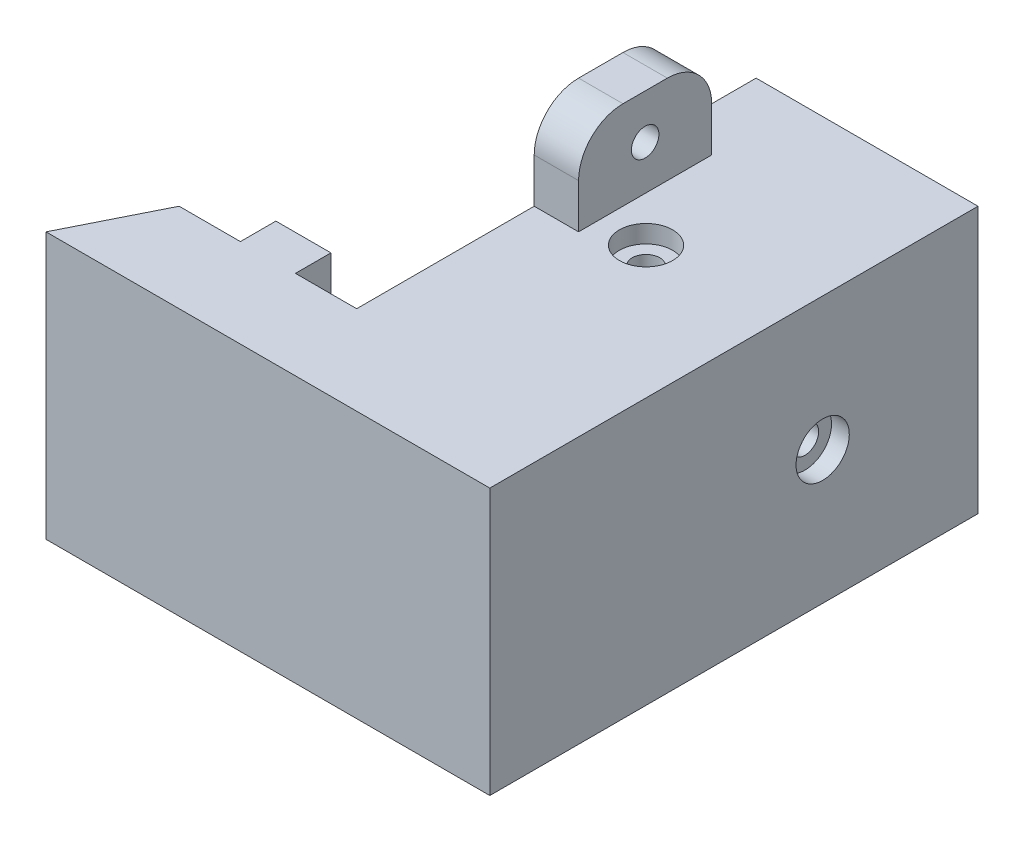
ISO-10303-21;
HEADER;
FILE_DESCRIPTION(('STEP AP214'),'2;1');
FILE_NAME('part.step','',(''),(''),'','','');
FILE_SCHEMA(('AUTOMOTIVE_DESIGN { 1 0 10303 214 1 1 1 1 }'));
ENDSEC;
DATA;
#1=APPLICATION_CONTEXT('core data for automotive mechanical design processes');
#2=APPLICATION_PROTOCOL_DEFINITION('international standard','automotive_design',2000,#1);
#3=PRODUCT_CONTEXT('',#1,'mechanical');
#4=PRODUCT('Part','Part','',(#3));
#5=PRODUCT_RELATED_PRODUCT_CATEGORY('part','',(#4));
#6=PRODUCT_DEFINITION_FORMATION('','',#4);
#7=PRODUCT_DEFINITION_CONTEXT('part definition',#1,'design');
#8=PRODUCT_DEFINITION('design','',#6,#7);
#9=PRODUCT_DEFINITION_SHAPE('','',#8);
#10=(LENGTH_UNIT() NAMED_UNIT(*) SI_UNIT(.MILLI.,.METRE.));
#11=(NAMED_UNIT(*) PLANE_ANGLE_UNIT() SI_UNIT($,.RADIAN.));
#12=(NAMED_UNIT(*) SI_UNIT($,.STERADIAN.) SOLID_ANGLE_UNIT());
#13=UNCERTAINTY_MEASURE_WITH_UNIT(LENGTH_MEASURE(1.E-05),#10,'distance_accuracy_value','');
#14=(GEOMETRIC_REPRESENTATION_CONTEXT(3) GLOBAL_UNCERTAINTY_ASSIGNED_CONTEXT((#13)) GLOBAL_UNIT_ASSIGNED_CONTEXT((#10,
#11,#12)) REPRESENTATION_CONTEXT('',''));
#15=CARTESIAN_POINT('',(0.,0.,0.));
#16=DIRECTION('',(0.,0.,1.));
#17=DIRECTION('',(1.,0.,0.));
#18=AXIS2_PLACEMENT_3D('',#15,#16,#17);
#19=CARTESIAN_POINT('',(30.,0.,-23.5));
#20=DIRECTION('',(1.,0.,0.));
#21=DIRECTION('',(0.,1.,0.));
#22=AXIS2_PLACEMENT_3D('',#19,#20,#21);
#23=CYLINDRICAL_SURFACE('',#22,1.55);
#24=CARTESIAN_POINT('',(30.2,0.,-23.5));
#25=DIRECTION('',(1.,0.,0.));
#26=DIRECTION('',(0.,0.,-1.));
#27=AXIS2_PLACEMENT_3D('',#24,#25,#26);
#28=CIRCLE('',#27,1.55);
#29=CARTESIAN_POINT('',(30.2,0.,-25.05));
#30=VERTEX_POINT('',#29);
#31=EDGE_CURVE('E417',#30,#30,#28,.T.);
#32=ORIENTED_EDGE('',*,*,#31,.F.);
#33=EDGE_LOOP('',(#32));
#34=FACE_BOUND('',#33,.T.);
#35=CARTESIAN_POINT('',(33.,0.,-23.5));
#36=DIRECTION('',(1.,0.,0.));
#37=DIRECTION('',(0.,1.,0.));
#38=AXIS2_PLACEMENT_3D('',#35,#36,#37);
#39=CIRCLE('',#38,1.55);
#40=CARTESIAN_POINT('',(33.,1.55,-23.5));
#41=VERTEX_POINT('',#40);
#42=EDGE_CURVE('E110',#41,#41,#39,.F.);
#43=ORIENTED_EDGE('',*,*,#42,.F.);
#44=EDGE_LOOP('',(#43));
#45=FACE_BOUND('',#44,.T.);
#46=ADVANCED_FACE('F106',(#34,#45),#23,.F.);
#47=CARTESIAN_POINT('',(20.1,110.,-18.5));
#48=DIRECTION('',(0.,-1.,0.));
#49=DIRECTION('',(0.,0.,-1.));
#50=AXIS2_PLACEMENT_3D('',#47,#48,#49);
#51=CYLINDRICAL_SURFACE('',#50,1.55);
#52=CARTESIAN_POINT('',(20.1,9.99999999999999,-18.5));
#53=DIRECTION('',(0.,-1.,0.));
#54=DIRECTION('',(0.,0.,-1.));
#55=AXIS2_PLACEMENT_3D('',#52,#53,#54);
#56=CIRCLE('',#55,1.55);
#57=CARTESIAN_POINT('',(20.1,9.99999999999999,-20.05));
#58=VERTEX_POINT('',#57);
#59=EDGE_CURVE('E296',#58,#58,#56,.T.);
#60=ORIENTED_EDGE('',*,*,#59,.T.);
#61=EDGE_LOOP('',(#60));
#62=FACE_BOUND('',#61,.T.);
#63=CARTESIAN_POINT('',(20.1,13.,-18.5));
#64=DIRECTION('',(0.,1.,0.));
#65=DIRECTION('',(0.,0.,1.));
#66=AXIS2_PLACEMENT_3D('',#63,#64,#65);
#67=CIRCLE('',#66,1.55);
#68=CARTESIAN_POINT('',(20.1,13.,-16.95));
#69=VERTEX_POINT('',#68);
#70=EDGE_CURVE('E412',#69,#69,#67,.F.);
#71=ORIENTED_EDGE('',*,*,#70,.F.);
#72=EDGE_LOOP('',(#71));
#73=FACE_BOUND('',#72,.T.);
#74=ADVANCED_FACE('F696',(#62,#73),#51,.F.);
#75=CARTESIAN_POINT('',(20.1,-85.,-18.5));
#76=DIRECTION('',(0.,1.,0.));
#77=DIRECTION('',(0.,0.,1.));
#78=AXIS2_PLACEMENT_3D('',#75,#76,#77);
#79=CYLINDRICAL_SURFACE('',#78,1.55);
#80=CARTESIAN_POINT('',(20.1,-9.99999999999999,-18.5));
#81=DIRECTION('',(0.,1.,0.));
#82=DIRECTION('',(0.,0.,1.));
#83=AXIS2_PLACEMENT_3D('',#80,#81,#82);
#84=CIRCLE('',#83,1.55);
#85=CARTESIAN_POINT('',(20.1,-9.99999999999999,-16.95));
#86=VERTEX_POINT('',#85);
#87=EDGE_CURVE('E410',#86,#86,#84,.F.);
#88=ORIENTED_EDGE('',*,*,#87,.F.);
#89=EDGE_LOOP('',(#88));
#90=FACE_BOUND('',#89,.T.);
#91=CARTESIAN_POINT('',(20.1,-13.,-18.5));
#92=DIRECTION('',(0.,-1.,0.));
#93=DIRECTION('',(0.,0.,-1.));
#94=AXIS2_PLACEMENT_3D('',#91,#92,#93);
#95=CIRCLE('',#94,1.55);
#96=CARTESIAN_POINT('',(20.1,-13.,-20.05));
#97=VERTEX_POINT('',#96);
#98=EDGE_CURVE('E406',#97,#97,#95,.T.);
#99=ORIENTED_EDGE('',*,*,#98,.T.);
#100=EDGE_LOOP('',(#99));
#101=FACE_BOUND('',#100,.T.);
#102=ADVANCED_FACE('F702',(#90,#101),#79,.F.);
#103=CARTESIAN_POINT('',(35.,-15.,14.));
#104=DIRECTION('',(0.,-1.,0.));
#105=DIRECTION('',(0.,0.,-1.));
#106=AXIS2_PLACEMENT_3D('',#103,#104,#105);
#107=PLANE('',#106);
#108=CARTESIAN_POINT('',(20.1,-15.,-18.5));
#109=DIRECTION('',(0.,-1.,0.));
#110=DIRECTION('',(0.,0.,-1.));
#111=AXIS2_PLACEMENT_3D('',#108,#109,#110);
#112=CIRCLE('',#111,3.);
#113=CARTESIAN_POINT('',(20.1,-15.,-21.5));
#114=VERTEX_POINT('',#113);
#115=EDGE_CURVE('E415',#114,#114,#112,.T.);
#116=ORIENTED_EDGE('',*,*,#115,.F.);
#117=EDGE_LOOP('',(#116));
#118=FACE_BOUND('',#117,.T.);
#119=DIRECTION('',(-1.,0.,0.));
#120=VECTOR('',#119,1.);
#121=CARTESIAN_POINT('',(15.,-15.,-31.));
#122=LINE('',#121,#120);
#123=CARTESIAN_POINT('',(15.,-15.,-31.));
#124=VERTEX_POINT('',#123);
#125=CARTESIAN_POINT('',(9.99999999999999,-15.,-31.));
#126=VERTEX_POINT('',#125);
#127=EDGE_CURVE('E570',#124,#126,#122,.T.);
#128=ORIENTED_EDGE('',*,*,#127,.T.);
#129=DIRECTION('',(0.,0.,-1.));
#130=VECTOR('',#129,1.);
#131=CARTESIAN_POINT('',(10.,-15.,14.));
#132=LINE('',#131,#130);
#133=CARTESIAN_POINT('',(10.,-15.,-41.));
#134=VERTEX_POINT('',#133);
#135=EDGE_CURVE('E456',#126,#134,#132,.T.);
#136=ORIENTED_EDGE('',*,*,#135,.T.);
#137=DIRECTION('',(-1.,0.,0.));
#138=VECTOR('',#137,1.);
#139=CARTESIAN_POINT('',(0.,-15.,-41.));
#140=LINE('',#139,#138);
#141=CARTESIAN_POINT('',(35.,-15.,-41.));
#142=VERTEX_POINT('',#141);
#143=EDGE_CURVE('E609',#142,#134,#140,.T.);
#144=ORIENTED_EDGE('',*,*,#143,.F.);
#145=DIRECTION('',(0.,0.,-1.));
#146=VECTOR('',#145,1.);
#147=CARTESIAN_POINT('',(35.,-15.,14.));
#148=LINE('',#147,#146);
#149=CARTESIAN_POINT('',(35.,-15.,14.));
#150=VERTEX_POINT('',#149);
#151=EDGE_CURVE('E343',#150,#142,#148,.T.);
#152=ORIENTED_EDGE('',*,*,#151,.F.);
#153=DIRECTION('',(-1.,0.,0.));
#154=VECTOR('',#153,1.);
#155=CARTESIAN_POINT('',(35.,-15.,14.));
#156=LINE('',#155,#154);
#157=CARTESIAN_POINT('',(-15.,-15.,14.));
#158=VERTEX_POINT('',#157);
#159=EDGE_CURVE('E370',#150,#158,#156,.T.);
#160=ORIENTED_EDGE('',*,*,#159,.T.);
#161=DIRECTION('',(0.447213595499958,0.,-0.894427190999916));
#162=VECTOR('',#161,1.);
#163=CARTESIAN_POINT('',(-6.4,-15.,-3.2));
#164=LINE('',#163,#162);
#165=CARTESIAN_POINT('',(-9.99999999999999,-15.,4.));
#166=VERTEX_POINT('',#165);
#167=EDGE_CURVE('E367',#158,#166,#164,.T.);
#168=ORIENTED_EDGE('',*,*,#167,.T.);
#169=DIRECTION('',(-1.,0.,0.));
#170=VECTOR('',#169,1.);
#171=CARTESIAN_POINT('',(35.,-15.,4.));
#172=LINE('',#171,#170);
#173=CARTESIAN_POINT('',(-3.1,-15.,4.));
#174=VERTEX_POINT('',#173);
#175=EDGE_CURVE('E374',#174,#166,#172,.T.);
#176=ORIENTED_EDGE('',*,*,#175,.F.);
#177=DIRECTION('',(0.,0.,-1.));
#178=VECTOR('',#177,1.);
#179=CARTESIAN_POINT('',(-3.1,-15.,10.));
#180=LINE('',#179,#178);
#181=CARTESIAN_POINT('',(-3.1,-15.,0.));
#182=VERTEX_POINT('',#181);
#183=EDGE_CURVE('E340',#174,#182,#180,.T.);
#184=ORIENTED_EDGE('',*,*,#183,.T.);
#185=DIRECTION('',(1.,0.,0.));
#186=VECTOR('',#185,1.);
#187=CARTESIAN_POINT('',(-3.1,-15.,0.));
#188=LINE('',#187,#186);
#189=CARTESIAN_POINT('',(3.1,-15.,0.));
#190=VERTEX_POINT('',#189);
#191=EDGE_CURVE('E335',#182,#190,#188,.T.);
#192=ORIENTED_EDGE('',*,*,#191,.T.);
#193=DIRECTION('',(0.,0.,-1.));
#194=VECTOR('',#193,1.);
#195=CARTESIAN_POINT('',(3.1,-15.,10.));
#196=LINE('',#195,#194);
#197=CARTESIAN_POINT('',(3.10000000000001,-15.,4.));
#198=VERTEX_POINT('',#197);
#199=EDGE_CURVE('E338',#198,#190,#196,.T.);
#200=ORIENTED_EDGE('',*,*,#199,.F.);
#201=CARTESIAN_POINT('',(9.99999999999999,-15.,4.));
#202=VERTEX_POINT('',#201);
#203=EDGE_CURVE('E371',#202,#198,#172,.T.);
#204=ORIENTED_EDGE('',*,*,#203,.F.);
#205=DIRECTION('',(0.,0.,1.));
#206=VECTOR('',#205,1.);
#207=CARTESIAN_POINT('',(9.99999999999999,-15.,-41.));
#208=LINE('',#207,#206);
#209=CARTESIAN_POINT('',(10.,-15.,-16.));
#210=VERTEX_POINT('',#209);
#211=EDGE_CURVE('E354',#210,#202,#208,.T.);
#212=ORIENTED_EDGE('',*,*,#211,.F.);
#213=DIRECTION('',(-1.,0.,0.));
#214=VECTOR('',#213,1.);
#215=CARTESIAN_POINT('',(15.,-15.,-16.));
#216=LINE('',#215,#214);
#217=CARTESIAN_POINT('',(15.,-15.,-16.));
#218=VERTEX_POINT('',#217);
#219=EDGE_CURVE('E560',#218,#210,#216,.T.);
#220=ORIENTED_EDGE('',*,*,#219,.F.);
#221=DIRECTION('',(0.,0.,-1.));
#222=VECTOR('',#221,1.);
#223=CARTESIAN_POINT('',(15.,-15.,0.));
#224=LINE('',#223,#222);
#225=EDGE_CURVE('E552',#218,#124,#224,.T.);
#226=ORIENTED_EDGE('',*,*,#225,.T.);
#227=EDGE_LOOP('',(#128,#136,#144,#152,#160,#168,#176,#184,#192,#200,#204,#212,#220,#226));
#228=FACE_BOUND('',#227,.T.);
#229=ADVANCED_FACE('F638',(#118,#228),#107,.T.);
#230=CARTESIAN_POINT('',(35.,15.,14.));
#231=DIRECTION('',(0.,-1.,0.));
#232=DIRECTION('',(0.,0.,-1.));
#233=AXIS2_PLACEMENT_3D('',#230,#231,#232);
#234=PLANE('',#233);
#235=CARTESIAN_POINT('',(20.1,15.,-18.5));
#236=DIRECTION('',(0.,1.,0.));
#237=DIRECTION('',(0.,0.,1.));
#238=AXIS2_PLACEMENT_3D('',#235,#236,#237);
#239=CIRCLE('',#238,3.);
#240=CARTESIAN_POINT('',(20.1,15.,-15.5));
#241=VERTEX_POINT('',#240);
#242=EDGE_CURVE('E420',#241,#241,#239,.T.);
#243=ORIENTED_EDGE('',*,*,#242,.F.);
#244=EDGE_LOOP('',(#243));
#245=FACE_BOUND('',#244,.T.);
#246=DIRECTION('',(0.,0.,1.));
#247=VECTOR('',#246,1.);
#248=CARTESIAN_POINT('',(10.,15.,0.));
#249=LINE('',#248,#247);
#250=CARTESIAN_POINT('',(10.,15.,-41.));
#251=VERTEX_POINT('',#250);
#252=CARTESIAN_POINT('',(10.,15.,-31.));
#253=VERTEX_POINT('',#252);
#254=EDGE_CURVE('E282',#251,#253,#249,.T.);
#255=ORIENTED_EDGE('',*,*,#254,.T.);
#256=DIRECTION('',(1.,0.,0.));
#257=VECTOR('',#256,1.);
#258=CARTESIAN_POINT('',(0.,15.,-31.));
#259=LINE('',#258,#257);
#260=CARTESIAN_POINT('',(15.,15.,-31.));
#261=VERTEX_POINT('',#260);
#262=EDGE_CURVE('E583',#253,#261,#259,.T.);
#263=ORIENTED_EDGE('',*,*,#262,.T.);
#264=DIRECTION('',(0.,0.,-1.));
#265=VECTOR('',#264,1.);
#266=CARTESIAN_POINT('',(15.,15.,0.));
#267=LINE('',#266,#265);
#268=CARTESIAN_POINT('',(15.,15.,-16.));
#269=VERTEX_POINT('',#268);
#270=EDGE_CURVE('E590',#269,#261,#267,.T.);
#271=ORIENTED_EDGE('',*,*,#270,.F.);
#272=DIRECTION('',(1.,0.,0.));
#273=VECTOR('',#272,1.);
#274=CARTESIAN_POINT('',(0.,15.,-16.));
#275=LINE('',#274,#273);
#276=CARTESIAN_POINT('',(10.,15.,-16.));
#277=VERTEX_POINT('',#276);
#278=EDGE_CURVE('E574',#277,#269,#275,.T.);
#279=ORIENTED_EDGE('',*,*,#278,.F.);
#280=DIRECTION('',(0.,0.,1.));
#281=VECTOR('',#280,1.);
#282=CARTESIAN_POINT('',(10.,15.,-41.));
#283=LINE('',#282,#281);
#284=CARTESIAN_POINT('',(10.,15.,4.));
#285=VERTEX_POINT('',#284);
#286=EDGE_CURVE('E314',#277,#285,#283,.T.);
#287=ORIENTED_EDGE('',*,*,#286,.T.);
#288=DIRECTION('',(-1.,0.,0.));
#289=VECTOR('',#288,1.);
#290=CARTESIAN_POINT('',(35.,15.,4.));
#291=LINE('',#290,#289);
#292=CARTESIAN_POINT('',(3.1,15.,4.));
#293=VERTEX_POINT('',#292);
#294=EDGE_CURVE('E361',#285,#293,#291,.T.);
#295=ORIENTED_EDGE('',*,*,#294,.T.);
#296=DIRECTION('',(0.,0.,-1.));
#297=VECTOR('',#296,1.);
#298=CARTESIAN_POINT('',(3.1,15.,10.));
#299=LINE('',#298,#297);
#300=CARTESIAN_POINT('',(3.1,15.,0.));
#301=VERTEX_POINT('',#300);
#302=EDGE_CURVE('E351',#293,#301,#299,.T.);
#303=ORIENTED_EDGE('',*,*,#302,.T.);
#304=DIRECTION('',(-1.,0.,0.));
#305=VECTOR('',#304,1.);
#306=CARTESIAN_POINT('',(3.1,15.,0.));
#307=LINE('',#306,#305);
#308=CARTESIAN_POINT('',(-3.1,15.,0.));
#309=VERTEX_POINT('',#308);
#310=EDGE_CURVE('E339',#301,#309,#307,.T.);
#311=ORIENTED_EDGE('',*,*,#310,.T.);
#312=DIRECTION('',(0.,0.,-1.));
#313=VECTOR('',#312,1.);
#314=CARTESIAN_POINT('',(-3.1,15.,10.));
#315=LINE('',#314,#313);
#316=CARTESIAN_POINT('',(-3.1,15.,4.));
#317=VERTEX_POINT('',#316);
#318=EDGE_CURVE('E347',#317,#309,#315,.T.);
#319=ORIENTED_EDGE('',*,*,#318,.F.);
#320=CARTESIAN_POINT('',(-10.,15.,4.));
#321=VERTEX_POINT('',#320);
#322=EDGE_CURVE('E364',#317,#321,#291,.T.);
#323=ORIENTED_EDGE('',*,*,#322,.T.);
#324=DIRECTION('',(0.447213595499958,0.,-0.894427190999916));
#325=VECTOR('',#324,1.);
#326=CARTESIAN_POINT('',(-6.4,15.,-3.2));
#327=LINE('',#326,#325);
#328=CARTESIAN_POINT('',(-15.,15.,14.));
#329=VERTEX_POINT('',#328);
#330=EDGE_CURVE('E379',#329,#321,#327,.T.);
#331=ORIENTED_EDGE('',*,*,#330,.F.);
#332=DIRECTION('',(-1.,0.,0.));
#333=VECTOR('',#332,1.);
#334=CARTESIAN_POINT('',(35.,15.,14.));
#335=LINE('',#334,#333);
#336=CARTESIAN_POINT('',(35.,15.,14.));
#337=VERTEX_POINT('',#336);
#338=EDGE_CURVE('E357',#337,#329,#335,.T.);
#339=ORIENTED_EDGE('',*,*,#338,.F.);
#340=DIRECTION('',(0.,0.,-1.));
#341=VECTOR('',#340,1.);
#342=CARTESIAN_POINT('',(35.,15.,14.));
#343=LINE('',#342,#341);
#344=CARTESIAN_POINT('',(35.,15.,-41.));
#345=VERTEX_POINT('',#344);
#346=EDGE_CURVE('E311',#337,#345,#343,.T.);
#347=ORIENTED_EDGE('',*,*,#346,.T.);
#348=DIRECTION('',(-1.,0.,0.));
#349=VECTOR('',#348,1.);
#350=CARTESIAN_POINT('',(35.,15.,-41.));
#351=LINE('',#350,#349);
#352=EDGE_CURVE('E303',#345,#251,#351,.T.);
#353=ORIENTED_EDGE('',*,*,#352,.T.);
#354=EDGE_LOOP('',(#255,#263,#271,#279,#287,#295,#303,#311,#319,#323,#331,#339,#347,#353));
#355=FACE_BOUND('',#354,.T.);
#356=ADVANCED_FACE('F309',(#245,#355),#234,.F.);
#357=CARTESIAN_POINT('',(0.,-10.,-41.));
#358=DIRECTION('',(0.,1.,0.));
#359=DIRECTION('',(0.,0.,1.));
#360=AXIS2_PLACEMENT_3D('',#357,#358,#359);
#361=PLANE('',#360);
#362=ORIENTED_EDGE('',*,*,#87,.T.);
#363=EDGE_LOOP('',(#362));
#364=FACE_BOUND('',#363,.T.);
#365=DIRECTION('',(-1.,0.,0.));
#366=VECTOR('',#365,1.);
#367=CARTESIAN_POINT('',(0.,-10.,-41.));
#368=LINE('',#367,#366);
#369=CARTESIAN_POINT('',(30.2,-10.,-41.));
#370=VERTEX_POINT('',#369);
#371=CARTESIAN_POINT('',(10.,-10.,-41.));
#372=VERTEX_POINT('',#371);
#373=EDGE_CURVE('E613',#370,#372,#368,.T.);
#374=ORIENTED_EDGE('',*,*,#373,.T.);
#375=DIRECTION('',(0.,0.,1.));
#376=VECTOR('',#375,1.);
#377=CARTESIAN_POINT('',(9.99999999999999,-10.,-41.));
#378=LINE('',#377,#376);
#379=CARTESIAN_POINT('',(9.99999999999999,-10.,4.));
#380=VERTEX_POINT('',#379);
#381=EDGE_CURVE('E617',#372,#380,#378,.T.);
#382=ORIENTED_EDGE('',*,*,#381,.T.);
#383=DIRECTION('',(-1.,0.,0.));
#384=VECTOR('',#383,1.);
#385=CARTESIAN_POINT('',(0.,-10.,4.));
#386=LINE('',#385,#384);
#387=CARTESIAN_POINT('',(30.2,-10.,4.));
#388=VERTEX_POINT('',#387);
#389=EDGE_CURVE('E610',#388,#380,#386,.T.);
#390=ORIENTED_EDGE('',*,*,#389,.F.);
#391=DIRECTION('',(0.,0.,-1.));
#392=VECTOR('',#391,1.);
#393=CARTESIAN_POINT('',(30.2,-10.,4.));
#394=LINE('',#393,#392);
#395=EDGE_CURVE('E469',#388,#370,#394,.T.);
#396=ORIENTED_EDGE('',*,*,#395,.T.);
#397=EDGE_LOOP('',(#374,#382,#390,#396));
#398=FACE_BOUND('',#397,.T.);
#399=ADVANCED_FACE('F660',(#364,#398),#361,.T.);
#400=CARTESIAN_POINT('',(0.,0.,-41.));
#401=DIRECTION('',(0.,0.,-1.));
#402=DIRECTION('',(-1.,0.,0.));
#403=AXIS2_PLACEMENT_3D('',#400,#401,#402);
#404=PLANE('',#403);
#405=ORIENTED_EDGE('',*,*,#143,.T.);
#406=DIRECTION('',(0.,1.,0.));
#407=VECTOR('',#406,1.);
#408=CARTESIAN_POINT('',(10.,-85.,-41.));
#409=LINE('',#408,#407);
#410=EDGE_CURVE('E307',#134,#372,#409,.T.);
#411=ORIENTED_EDGE('',*,*,#410,.T.);
#412=ORIENTED_EDGE('',*,*,#373,.F.);
#413=DIRECTION('',(0.,-1.,0.));
#414=VECTOR('',#413,1.);
#415=CARTESIAN_POINT('',(30.2,9.99999999999999,-41.));
#416=LINE('',#415,#414);
#417=CARTESIAN_POINT('',(30.2,9.99999999999999,-41.));
#418=VERTEX_POINT('',#417);
#419=EDGE_CURVE('E460',#418,#370,#416,.T.);
#420=ORIENTED_EDGE('',*,*,#419,.F.);
#421=DIRECTION('',(-1.,0.,0.));
#422=VECTOR('',#421,1.);
#423=CARTESIAN_POINT('',(35.,9.99999999999999,-41.));
#424=LINE('',#423,#422);
#425=CARTESIAN_POINT('',(10.,9.99999999999999,-41.));
#426=VERTEX_POINT('',#425);
#427=EDGE_CURVE('E305',#418,#426,#424,.T.);
#428=ORIENTED_EDGE('',*,*,#427,.T.);
#429=EDGE_CURVE('E286',#426,#251,#409,.T.);
#430=ORIENTED_EDGE('',*,*,#429,.T.);
#431=ORIENTED_EDGE('',*,*,#352,.F.);
#432=DIRECTION('',(0.,-1.,0.));
#433=VECTOR('',#432,1.);
#434=CARTESIAN_POINT('',(35.,0.,-41.));
#435=LINE('',#434,#433);
#436=EDGE_CURVE('E606',#345,#142,#435,.T.);
#437=ORIENTED_EDGE('',*,*,#436,.T.);
#438=EDGE_LOOP('',(#405,#411,#412,#420,#428,#430,#431,#437));
#439=FACE_BOUND('',#438,.T.);
#440=ADVANCED_FACE('F301',(#439),#404,.T.);
#441=CARTESIAN_POINT('',(35.,9.99999999999999,-41.));
#442=DIRECTION('',(0.,1.,0.));
#443=DIRECTION('',(0.,0.,1.));
#444=AXIS2_PLACEMENT_3D('',#441,#442,#443);
#445=PLANE('',#444);
#446=ORIENTED_EDGE('',*,*,#59,.F.);
#447=EDGE_LOOP('',(#446));
#448=FACE_BOUND('',#447,.T.);
#449=DIRECTION('',(0.,0.,1.));
#450=VECTOR('',#449,1.);
#451=CARTESIAN_POINT('',(10.,9.99999999999999,-41.));
#452=LINE('',#451,#450);
#453=CARTESIAN_POINT('',(10.,9.99999999999999,4.));
#454=VERTEX_POINT('',#453);
#455=EDGE_CURVE('E318',#426,#454,#452,.T.);
#456=ORIENTED_EDGE('',*,*,#455,.F.);
#457=ORIENTED_EDGE('',*,*,#427,.F.);
#458=DIRECTION('',(0.,0.,-1.));
#459=VECTOR('',#458,1.);
#460=CARTESIAN_POINT('',(30.2,9.99999999999999,4.));
#461=LINE('',#460,#459);
#462=CARTESIAN_POINT('',(30.2,9.99999999999999,4.));
#463=VERTEX_POINT('',#462);
#464=EDGE_CURVE('E465',#463,#418,#461,.T.);
#465=ORIENTED_EDGE('',*,*,#464,.F.);
#466=DIRECTION('',(-1.,0.,0.));
#467=VECTOR('',#466,1.);
#468=CARTESIAN_POINT('',(35.,9.99999999999999,4.));
#469=LINE('',#468,#467);
#470=EDGE_CURVE('E324',#463,#454,#469,.T.);
#471=ORIENTED_EDGE('',*,*,#470,.T.);
#472=EDGE_LOOP('',(#456,#457,#465,#471));
#473=FACE_BOUND('',#472,.T.);
#474=ADVANCED_FACE('F654',(#448,#473),#445,.F.);
#475=CARTESIAN_POINT('',(9.99999999999999,0.,-41.));
#476=DIRECTION('',(1.,0.,0.));
#477=DIRECTION('',(0.,0.,-1.));
#478=AXIS2_PLACEMENT_3D('',#475,#476,#477);
#479=PLANE('',#478);
#480=CARTESIAN_POINT('',(9.99999999999999,-20.,-23.5));
#481=DIRECTION('',(-1.,0.,0.));
#482=DIRECTION('',(0.,0.,1.));
#483=AXIS2_PLACEMENT_3D('',#480,#481,#482);
#484=CIRCLE('',#483,1.55);
#485=CARTESIAN_POINT('',(9.99999999999999,-20.,-21.95));
#486=VERTEX_POINT('',#485);
#487=EDGE_CURVE('E537',#486,#486,#484,.T.);
#488=ORIENTED_EDGE('',*,*,#487,.F.);
#489=EDGE_LOOP('',(#488));
#490=FACE_BOUND('',#489,.T.);
#491=ORIENTED_EDGE('',*,*,#381,.F.);
#492=ORIENTED_EDGE('',*,*,#410,.F.);
#493=ORIENTED_EDGE('',*,*,#135,.F.);
#494=DIRECTION('',(0.,-1.,0.));
#495=VECTOR('',#494,1.);
#496=CARTESIAN_POINT('',(10.,0.,-31.));
#497=LINE('',#496,#495);
#498=CARTESIAN_POINT('',(9.99999999999999,-20.,-31.));
#499=VERTEX_POINT('',#498);
#500=EDGE_CURVE('E549',#126,#499,#497,.T.);
#501=ORIENTED_EDGE('',*,*,#500,.T.);
#502=CARTESIAN_POINT('',(9.99999999999999,-20.,-26.));
#503=DIRECTION('',(-1.,0.,0.));
#504=DIRECTION('',(0.,0.,1.));
#505=AXIS2_PLACEMENT_3D('',#502,#503,#504);
#506=CIRCLE('',#505,5.);
#507=CARTESIAN_POINT('',(9.99999999999999,-25.,-26.));
#508=VERTEX_POINT('',#507);
#509=EDGE_CURVE('E480',#499,#508,#506,.T.);
#510=ORIENTED_EDGE('',*,*,#509,.T.);
#511=DIRECTION('',(0.,0.,1.));
#512=VECTOR('',#511,1.);
#513=CARTESIAN_POINT('',(10.,-25.,0.));
#514=LINE('',#513,#512);
#515=CARTESIAN_POINT('',(9.99999999999999,-25.,-21.));
#516=VERTEX_POINT('',#515);
#517=EDGE_CURVE('E532',#508,#516,#514,.T.);
#518=ORIENTED_EDGE('',*,*,#517,.T.);
#519=CARTESIAN_POINT('',(9.99999999999999,-20.,-21.));
#520=DIRECTION('',(-1.,0.,0.));
#521=DIRECTION('',(0.,0.,1.));
#522=AXIS2_PLACEMENT_3D('',#519,#520,#521);
#523=CIRCLE('',#522,5.);
#524=CARTESIAN_POINT('',(9.99999999999999,-20.,-16.));
#525=VERTEX_POINT('',#524);
#526=EDGE_CURVE('E473',#525,#516,#523,.F.);
#527=ORIENTED_EDGE('',*,*,#526,.F.);
#528=DIRECTION('',(0.,1.,0.));
#529=VECTOR('',#528,1.);
#530=CARTESIAN_POINT('',(10.,0.,-16.));
#531=LINE('',#530,#529);
#532=EDGE_CURVE('E564',#525,#210,#531,.T.);
#533=ORIENTED_EDGE('',*,*,#532,.T.);
#534=ORIENTED_EDGE('',*,*,#211,.T.);
#535=DIRECTION('',(0.,1.,0.));
#536=VECTOR('',#535,1.);
#537=CARTESIAN_POINT('',(9.99999999999999,0.,4.));
#538=LINE('',#537,#536);
#539=EDGE_CURVE('E334',#202,#380,#538,.T.);
#540=ORIENTED_EDGE('',*,*,#539,.T.);
#541=EDGE_LOOP('',(#491,#492,#493,#501,#510,#518,#527,#533,#534,#540));
#542=FACE_BOUND('',#541,.T.);
#543=ADVANCED_FACE('F629',(#490,#542),#479,.F.);
#544=CARTESIAN_POINT('',(15.,0.,-31.));
#545=DIRECTION('',(0.,0.,-1.));
#546=DIRECTION('',(0.,1.,0.));
#547=AXIS2_PLACEMENT_3D('',#544,#545,#546);
#548=PLANE('',#547);
#549=DIRECTION('',(0.,-1.,0.));
#550=VECTOR('',#549,1.);
#551=CARTESIAN_POINT('',(15.,0.,-31.));
#552=LINE('',#551,#550);
#553=CARTESIAN_POINT('',(15.,-20.,-31.));
#554=VERTEX_POINT('',#553);
#555=EDGE_CURVE('E556',#124,#554,#552,.T.);
#556=ORIENTED_EDGE('',*,*,#555,.T.);
#557=DIRECTION('',(-1.,0.,0.));
#558=VECTOR('',#557,1.);
#559=CARTESIAN_POINT('',(15.,-20.,-31.));
#560=LINE('',#559,#558);
#561=EDGE_CURVE('E124',#554,#499,#560,.T.);
#562=ORIENTED_EDGE('',*,*,#561,.T.);
#563=ORIENTED_EDGE('',*,*,#500,.F.);
#564=ORIENTED_EDGE('',*,*,#127,.F.);
#565=EDGE_LOOP('',(#556,#562,#563,#564));
#566=FACE_BOUND('',#565,.T.);
#567=ADVANCED_FACE('F667',(#566),#548,.T.);
#568=CARTESIAN_POINT('',(15.,0.,-16.));
#569=DIRECTION('',(0.,0.,1.));
#570=DIRECTION('',(0.,-1.,0.));
#571=AXIS2_PLACEMENT_3D('',#568,#569,#570);
#572=PLANE('',#571);
#573=ORIENTED_EDGE('',*,*,#532,.F.);
#574=DIRECTION('',(-1.,0.,0.));
#575=VECTOR('',#574,1.);
#576=CARTESIAN_POINT('',(15.,-20.,-16.));
#577=LINE('',#576,#575);
#578=CARTESIAN_POINT('',(15.,-20.,-16.));
#579=VERTEX_POINT('',#578);
#580=EDGE_CURVE('E493',#579,#525,#577,.T.);
#581=ORIENTED_EDGE('',*,*,#580,.F.);
#582=DIRECTION('',(0.,1.,0.));
#583=VECTOR('',#582,1.);
#584=CARTESIAN_POINT('',(15.,0.,-16.));
#585=LINE('',#584,#583);
#586=EDGE_CURVE('E548',#579,#218,#585,.T.);
#587=ORIENTED_EDGE('',*,*,#586,.T.);
#588=ORIENTED_EDGE('',*,*,#219,.T.);
#589=EDGE_LOOP('',(#573,#581,#587,#588));
#590=FACE_BOUND('',#589,.T.);
#591=ADVANCED_FACE('F676',(#590),#572,.T.);
#592=CARTESIAN_POINT('',(15.,0.,0.));
#593=DIRECTION('',(-1.,0.,0.));
#594=DIRECTION('',(0.,0.,1.));
#595=AXIS2_PLACEMENT_3D('',#592,#593,#594);
#596=PLANE('',#595);
#597=CARTESIAN_POINT('',(15.,-20.,-26.));
#598=DIRECTION('',(-1.,0.,0.));
#599=DIRECTION('',(0.,0.,1.));
#600=AXIS2_PLACEMENT_3D('',#597,#598,#599);
#601=CIRCLE('',#600,5.);
#602=CARTESIAN_POINT('',(15.,-25.,-26.));
#603=VERTEX_POINT('',#602);
#604=EDGE_CURVE('E477',#554,#603,#601,.T.);
#605=ORIENTED_EDGE('',*,*,#604,.F.);
#606=ORIENTED_EDGE('',*,*,#555,.F.);
#607=ORIENTED_EDGE('',*,*,#225,.F.);
#608=ORIENTED_EDGE('',*,*,#586,.F.);
#609=CARTESIAN_POINT('',(15.,-20.,-21.));
#610=DIRECTION('',(-1.,0.,0.));
#611=DIRECTION('',(0.,0.,1.));
#612=AXIS2_PLACEMENT_3D('',#609,#610,#611);
#613=CIRCLE('',#612,5.);
#614=CARTESIAN_POINT('',(15.,-25.,-21.));
#615=VERTEX_POINT('',#614);
#616=EDGE_CURVE('E490',#579,#615,#613,.F.);
#617=ORIENTED_EDGE('',*,*,#616,.T.);
#618=DIRECTION('',(0.,0.,1.));
#619=VECTOR('',#618,1.);
#620=CARTESIAN_POINT('',(15.,-25.,0.));
#621=LINE('',#620,#619);
#622=EDGE_CURVE('E544',#603,#615,#621,.T.);
#623=ORIENTED_EDGE('',*,*,#622,.F.);
#624=EDGE_LOOP('',(#605,#606,#607,#608,#617,#623));
#625=FACE_BOUND('',#624,.T.);
#626=CARTESIAN_POINT('',(15.,-20.,-23.5));
#627=DIRECTION('',(-1.,0.,0.));
#628=DIRECTION('',(0.,0.,1.));
#629=AXIS2_PLACEMENT_3D('',#626,#627,#628);
#630=CIRCLE('',#629,1.55);
#631=CARTESIAN_POINT('',(15.,-20.,-21.95));
#632=VERTEX_POINT('',#631);
#633=EDGE_CURVE('E513',#632,#632,#630,.T.);
#634=ORIENTED_EDGE('',*,*,#633,.T.);
#635=EDGE_LOOP('',(#634));
#636=FACE_BOUND('',#635,.T.);
#637=ADVANCED_FACE('F671',(#625,#636),#596,.F.);
#638=CARTESIAN_POINT('',(10.,15.,-41.));
#639=DIRECTION('',(-1.,0.,0.));
#640=DIRECTION('',(0.,0.,1.));
#641=AXIS2_PLACEMENT_3D('',#638,#639,#640);
#642=PLANE('',#641);
#643=DIRECTION('',(0.,-1.,0.));
#644=VECTOR('',#643,1.);
#645=CARTESIAN_POINT('',(10.,25.,-31.));
#646=LINE('',#645,#644);
#647=CARTESIAN_POINT('',(10.,20.,-31.));
#648=VERTEX_POINT('',#647);
#649=EDGE_CURVE('E290',#648,#253,#646,.T.);
#650=ORIENTED_EDGE('',*,*,#649,.T.);
#651=ORIENTED_EDGE('',*,*,#254,.F.);
#652=ORIENTED_EDGE('',*,*,#429,.F.);
#653=ORIENTED_EDGE('',*,*,#455,.T.);
#654=DIRECTION('',(0.,-1.,0.));
#655=VECTOR('',#654,1.);
#656=CARTESIAN_POINT('',(10.,15.,4.));
#657=LINE('',#656,#655);
#658=EDGE_CURVE('E320',#285,#454,#657,.T.);
#659=ORIENTED_EDGE('',*,*,#658,.F.);
#660=ORIENTED_EDGE('',*,*,#286,.F.);
#661=DIRECTION('',(0.,-1.,0.));
#662=VECTOR('',#661,1.);
#663=CARTESIAN_POINT('',(10.,25.,-16.));
#664=LINE('',#663,#662);
#665=CARTESIAN_POINT('',(10.,20.,-16.));
#666=VERTEX_POINT('',#665);
#667=EDGE_CURVE('E328',#666,#277,#664,.T.);
#668=ORIENTED_EDGE('',*,*,#667,.F.);
#669=CARTESIAN_POINT('',(10.,20.,-21.));
#670=DIRECTION('',(-1.,0.,0.));
#671=DIRECTION('',(0.,0.,1.));
#672=AXIS2_PLACEMENT_3D('',#669,#670,#671);
#673=CIRCLE('',#672,5.);
#674=CARTESIAN_POINT('',(10.,25.,-21.));
#675=VERTEX_POINT('',#674);
#676=EDGE_CURVE('E508',#666,#675,#673,.T.);
#677=ORIENTED_EDGE('',*,*,#676,.T.);
#678=DIRECTION('',(0.,0.,1.));
#679=VECTOR('',#678,1.);
#680=CARTESIAN_POINT('',(10.,25.,0.));
#681=LINE('',#680,#679);
#682=CARTESIAN_POINT('',(10.,25.,-26.));
#683=VERTEX_POINT('',#682);
#684=EDGE_CURVE('E578',#683,#675,#681,.T.);
#685=ORIENTED_EDGE('',*,*,#684,.F.);
#686=CARTESIAN_POINT('',(10.,20.,-26.));
#687=DIRECTION('',(-1.,0.,0.));
#688=DIRECTION('',(0.,0.,1.));
#689=AXIS2_PLACEMENT_3D('',#686,#687,#688);
#690=CIRCLE('',#689,5.);
#691=EDGE_CURVE('E505',#648,#683,#690,.F.);
#692=ORIENTED_EDGE('',*,*,#691,.F.);
#693=EDGE_LOOP('',(#650,#651,#652,#653,#659,#660,#668,#677,#685,#692));
#694=FACE_BOUND('',#693,.T.);
#695=CARTESIAN_POINT('',(9.99999999999999,20.,-23.5));
#696=DIRECTION('',(-1.,0.,0.));
#697=DIRECTION('',(0.,0.,1.));
#698=AXIS2_PLACEMENT_3D('',#695,#696,#697);
#699=CIRCLE('',#698,1.55);
#700=CARTESIAN_POINT('',(9.99999999999999,20.,-21.95));
#701=VERTEX_POINT('',#700);
#702=EDGE_CURVE('E533',#701,#701,#699,.T.);
#703=ORIENTED_EDGE('',*,*,#702,.F.);
#704=EDGE_LOOP('',(#703));
#705=FACE_BOUND('',#704,.T.);
#706=ADVANCED_FACE('F284',(#694,#705),#642,.T.);
#707=CARTESIAN_POINT('',(15.,25.,0.));
#708=DIRECTION('',(-1.,0.,0.));
#709=DIRECTION('',(0.,0.,1.));
#710=AXIS2_PLACEMENT_3D('',#707,#708,#709);
#711=PLANE('',#710);
#712=CARTESIAN_POINT('',(15.,20.,-23.5));
#713=DIRECTION('',(-1.,0.,0.));
#714=DIRECTION('',(0.,0.,1.));
#715=AXIS2_PLACEMENT_3D('',#712,#713,#714);
#716=CIRCLE('',#715,1.55);
#717=CARTESIAN_POINT('',(15.,20.,-21.95));
#718=VERTEX_POINT('',#717);
#719=EDGE_CURVE('E528',#718,#718,#716,.T.);
#720=ORIENTED_EDGE('',*,*,#719,.T.);
#721=EDGE_LOOP('',(#720));
#722=FACE_BOUND('',#721,.T.);
#723=DIRECTION('',(0.,-1.,0.));
#724=VECTOR('',#723,1.);
#725=CARTESIAN_POINT('',(15.,25.,-31.));
#726=LINE('',#725,#724);
#727=CARTESIAN_POINT('',(15.,20.,-31.));
#728=VERTEX_POINT('',#727);
#729=EDGE_CURVE('E598',#728,#261,#726,.T.);
#730=ORIENTED_EDGE('',*,*,#729,.F.);
#731=CARTESIAN_POINT('',(15.,20.,-26.));
#732=DIRECTION('',(-1.,0.,0.));
#733=DIRECTION('',(0.,0.,1.));
#734=AXIS2_PLACEMENT_3D('',#731,#732,#733);
#735=CIRCLE('',#734,5.);
#736=CARTESIAN_POINT('',(15.,25.,-26.));
#737=VERTEX_POINT('',#736);
#738=EDGE_CURVE('E500',#728,#737,#735,.F.);
#739=ORIENTED_EDGE('',*,*,#738,.T.);
#740=DIRECTION('',(0.,0.,-1.));
#741=VECTOR('',#740,1.);
#742=CARTESIAN_POINT('',(15.,25.,0.));
#743=LINE('',#742,#741);
#744=CARTESIAN_POINT('',(15.,25.,-21.));
#745=VERTEX_POINT('',#744);
#746=EDGE_CURVE('E582',#745,#737,#743,.T.);
#747=ORIENTED_EDGE('',*,*,#746,.F.);
#748=CARTESIAN_POINT('',(15.,20.,-21.));
#749=DIRECTION('',(-1.,0.,0.));
#750=DIRECTION('',(0.,0.,1.));
#751=AXIS2_PLACEMENT_3D('',#748,#749,#750);
#752=CIRCLE('',#751,5.);
#753=CARTESIAN_POINT('',(15.,20.,-16.));
#754=VERTEX_POINT('',#753);
#755=EDGE_CURVE('E520',#754,#745,#752,.T.);
#756=ORIENTED_EDGE('',*,*,#755,.F.);
#757=DIRECTION('',(0.,-1.,0.));
#758=VECTOR('',#757,1.);
#759=CARTESIAN_POINT('',(15.,25.,-16.));
#760=LINE('',#759,#758);
#761=EDGE_CURVE('E601',#754,#269,#760,.T.);
#762=ORIENTED_EDGE('',*,*,#761,.T.);
#763=ORIENTED_EDGE('',*,*,#270,.T.);
#764=EDGE_LOOP('',(#730,#739,#747,#756,#762,#763));
#765=FACE_BOUND('',#764,.T.);
#766=ADVANCED_FACE('F869',(#722,#765),#711,.F.);
#767=CARTESIAN_POINT('',(0.,25.,-31.));
#768=DIRECTION('',(0.,0.,-1.));
#769=DIRECTION('',(-1.,0.,0.));
#770=AXIS2_PLACEMENT_3D('',#767,#768,#769);
#771=PLANE('',#770);
#772=ORIENTED_EDGE('',*,*,#649,.F.);
#773=DIRECTION('',(-1.,0.,0.));
#774=VECTOR('',#773,1.);
#775=CARTESIAN_POINT('',(15.,20.,-31.));
#776=LINE('',#775,#774);
#777=EDGE_CURVE('E504',#728,#648,#776,.T.);
#778=ORIENTED_EDGE('',*,*,#777,.F.);
#779=ORIENTED_EDGE('',*,*,#729,.T.);
#780=ORIENTED_EDGE('',*,*,#262,.F.);
#781=EDGE_LOOP('',(#772,#778,#779,#780));
#782=FACE_BOUND('',#781,.T.);
#783=ADVANCED_FACE('F876',(#782),#771,.T.);
#784=CARTESIAN_POINT('',(0.,-22.,4.));
#785=DIRECTION('',(0.,0.,-1.));
#786=DIRECTION('',(-1.,0.,0.));
#787=AXIS2_PLACEMENT_3D('',#784,#785,#786);
#788=PLANE('',#787);
#789=ORIENTED_EDGE('',*,*,#389,.T.);
#790=ORIENTED_EDGE('',*,*,#539,.F.);
#791=ORIENTED_EDGE('',*,*,#203,.T.);
#792=DIRECTION('',(0.,1.,0.));
#793=VECTOR('',#792,1.);
#794=CARTESIAN_POINT('',(3.1,-22.,4.));
#795=LINE('',#794,#793);
#796=EDGE_CURVE('E387',#198,#293,#795,.T.);
#797=ORIENTED_EDGE('',*,*,#796,.T.);
#798=ORIENTED_EDGE('',*,*,#294,.F.);
#799=ORIENTED_EDGE('',*,*,#658,.T.);
#800=ORIENTED_EDGE('',*,*,#470,.F.);
#801=DIRECTION('',(0.,-1.,0.));
#802=VECTOR('',#801,1.);
#803=CARTESIAN_POINT('',(30.2,9.99999999999999,4.));
#804=LINE('',#803,#802);
#805=EDGE_CURVE('E461',#463,#388,#804,.T.);
#806=ORIENTED_EDGE('',*,*,#805,.T.);
#807=EDGE_LOOP('',(#789,#790,#791,#797,#798,#799,#800,#806));
#808=FACE_BOUND('',#807,.T.);
#809=ADVANCED_FACE('F636',(#808),#788,.T.);
#810=CARTESIAN_POINT('',(0.,0.,14.));
#811=DIRECTION('',(0.,0.,1.));
#812=DIRECTION('',(1.,0.,0.));
#813=AXIS2_PLACEMENT_3D('',#810,#811,#812);
#814=PLANE('',#813);
#815=ORIENTED_EDGE('',*,*,#338,.T.);
#816=DIRECTION('',(0.,-1.,0.));
#817=VECTOR('',#816,1.);
#818=CARTESIAN_POINT('',(-15.,22.,14.));
#819=LINE('',#818,#817);
#820=EDGE_CURVE('E12',#329,#158,#819,.T.);
#821=ORIENTED_EDGE('',*,*,#820,.T.);
#822=ORIENTED_EDGE('',*,*,#159,.F.);
#823=DIRECTION('',(0.,-1.,0.));
#824=VECTOR('',#823,1.);
#825=CARTESIAN_POINT('',(35.,22.,14.));
#826=LINE('',#825,#824);
#827=EDGE_CURVE('E383',#337,#150,#826,.T.);
#828=ORIENTED_EDGE('',*,*,#827,.F.);
#829=EDGE_LOOP('',(#815,#821,#822,#828));
#830=FACE_BOUND('',#829,.T.);
#831=ADVANCED_FACE('F891',(#830),#814,.T.);
#832=CARTESIAN_POINT('',(0.,-22.,4.));
#833=DIRECTION('',(0.,0.,-1.));
#834=DIRECTION('',(-1.,0.,0.));
#835=AXIS2_PLACEMENT_3D('',#832,#833,#834);
#836=PLANE('',#835);
#837=ORIENTED_EDGE('',*,*,#322,.F.);
#838=DIRECTION('',(0.,1.,0.));
#839=VECTOR('',#838,1.);
#840=CARTESIAN_POINT('',(-3.1,-22.,4.));
#841=LINE('',#840,#839);
#842=EDGE_CURVE('E116',#174,#317,#841,.T.);
#843=ORIENTED_EDGE('',*,*,#842,.F.);
#844=ORIENTED_EDGE('',*,*,#175,.T.);
#845=DIRECTION('',(0.,1.,0.));
#846=VECTOR('',#845,1.);
#847=CARTESIAN_POINT('',(-10.,-22.,4.));
#848=LINE('',#847,#846);
#849=EDGE_CURVE('E391',#166,#321,#848,.T.);
#850=ORIENTED_EDGE('',*,*,#849,.T.);
#851=EDGE_LOOP('',(#837,#843,#844,#850));
#852=FACE_BOUND('',#851,.T.);
#853=ADVANCED_FACE('F898',(#852),#836,.T.);
#854=CARTESIAN_POINT('',(-6.4,-22.,-3.2));
#855=DIRECTION('',(0.894427190999916,0.,0.447213595499958));
#856=DIRECTION('',(0.447213595499958,0.,-0.894427190999916));
#857=AXIS2_PLACEMENT_3D('',#854,#855,#856);
#858=PLANE('',#857);
#859=ORIENTED_EDGE('',*,*,#820,.F.);
#860=ORIENTED_EDGE('',*,*,#330,.T.);
#861=ORIENTED_EDGE('',*,*,#849,.F.);
#862=ORIENTED_EDGE('',*,*,#167,.F.);
#863=EDGE_LOOP('',(#859,#860,#861,#862));
#864=FACE_BOUND('',#863,.T.);
#865=ADVANCED_FACE('F906',(#864),#858,.F.);
#866=CARTESIAN_POINT('',(35.,22.,14.));
#867=DIRECTION('',(1.,0.,0.));
#868=DIRECTION('',(0.,1.,0.));
#869=AXIS2_PLACEMENT_3D('',#866,#867,#868);
#870=PLANE('',#869);
#871=CARTESIAN_POINT('',(35.,0.,-23.5));
#872=DIRECTION('',(1.,0.,0.));
#873=DIRECTION('',(0.,1.,0.));
#874=AXIS2_PLACEMENT_3D('',#871,#872,#873);
#875=CIRCLE('',#874,3.);
#876=CARTESIAN_POINT('',(35.,3.,-23.5));
#877=VERTEX_POINT('',#876);
#878=EDGE_CURVE('E433',#877,#877,#875,.T.);
#879=ORIENTED_EDGE('',*,*,#878,.F.);
#880=EDGE_LOOP('',(#879));
#881=FACE_BOUND('',#880,.T.);
#882=ORIENTED_EDGE('',*,*,#346,.F.);
#883=ORIENTED_EDGE('',*,*,#827,.T.);
#884=ORIENTED_EDGE('',*,*,#151,.T.);
#885=ORIENTED_EDGE('',*,*,#436,.F.);
#886=EDGE_LOOP('',(#882,#883,#884,#885));
#887=FACE_BOUND('',#886,.T.);
#888=ADVANCED_FACE('F914',(#881,#887),#870,.T.);
#889=CARTESIAN_POINT('',(0.,0.,0.));
#890=DIRECTION('',(0.,0.,1.));
#891=DIRECTION('',(1.,0.,0.));
#892=AXIS2_PLACEMENT_3D('',#889,#890,#891);
#893=PLANE('',#892);
#894=DIRECTION('',(0.,1.,0.));
#895=VECTOR('',#894,1.);
#896=CARTESIAN_POINT('',(3.1,-22.,0.));
#897=LINE('',#896,#895);
#898=EDGE_CURVE('E399',#190,#301,#897,.T.);
#899=ORIENTED_EDGE('',*,*,#898,.F.);
#900=ORIENTED_EDGE('',*,*,#191,.F.);
#901=DIRECTION('',(0.,1.,0.));
#902=VECTOR('',#901,1.);
#903=CARTESIAN_POINT('',(-3.1,-22.,0.));
#904=LINE('',#903,#902);
#905=EDGE_CURVE('E395',#182,#309,#904,.T.);
#906=ORIENTED_EDGE('',*,*,#905,.T.);
#907=ORIENTED_EDGE('',*,*,#310,.F.);
#908=EDGE_LOOP('',(#899,#900,#906,#907));
#909=FACE_BOUND('',#908,.T.);
#910=ADVANCED_FACE('F108',(#909),#893,.F.);
#911=CARTESIAN_POINT('',(3.1,-22.,0.));
#912=DIRECTION('',(1.,0.,0.));
#913=DIRECTION('',(0.,0.,-1.));
#914=AXIS2_PLACEMENT_3D('',#911,#912,#913);
#915=PLANE('',#914);
#916=ORIENTED_EDGE('',*,*,#199,.T.);
#917=ORIENTED_EDGE('',*,*,#898,.T.);
#918=ORIENTED_EDGE('',*,*,#302,.F.);
#919=ORIENTED_EDGE('',*,*,#796,.F.);
#920=EDGE_LOOP('',(#916,#917,#918,#919));
#921=FACE_BOUND('',#920,.T.);
#922=ADVANCED_FACE('F644',(#921),#915,.T.);
#923=CARTESIAN_POINT('',(-3.1,-22.,0.));
#924=DIRECTION('',(-1.,0.,0.));
#925=DIRECTION('',(0.,0.,1.));
#926=AXIS2_PLACEMENT_3D('',#923,#924,#925);
#927=PLANE('',#926);
#928=ORIENTED_EDGE('',*,*,#183,.F.);
#929=ORIENTED_EDGE('',*,*,#842,.T.);
#930=ORIENTED_EDGE('',*,*,#318,.T.);
#931=ORIENTED_EDGE('',*,*,#905,.F.);
#932=EDGE_LOOP('',(#928,#929,#930,#931));
#933=FACE_BOUND('',#932,.T.);
#934=ADVANCED_FACE('F933',(#933),#927,.T.);
#935=CARTESIAN_POINT('',(0.,25.,-16.));
#936=DIRECTION('',(0.,0.,-1.));
#937=DIRECTION('',(-1.,0.,0.));
#938=AXIS2_PLACEMENT_3D('',#935,#936,#937);
#939=PLANE('',#938);
#940=ORIENTED_EDGE('',*,*,#761,.F.);
#941=DIRECTION('',(-1.,0.,0.));
#942=VECTOR('',#941,1.);
#943=CARTESIAN_POINT('',(15.,20.,-16.));
#944=LINE('',#943,#942);
#945=EDGE_CURVE('E516',#754,#666,#944,.T.);
#946=ORIENTED_EDGE('',*,*,#945,.T.);
#947=ORIENTED_EDGE('',*,*,#667,.T.);
#948=ORIENTED_EDGE('',*,*,#278,.T.);
#949=EDGE_LOOP('',(#940,#946,#947,#948));
#950=FACE_BOUND('',#949,.T.);
#951=ADVANCED_FACE('F940',(#950),#939,.F.);
#952=CARTESIAN_POINT('',(0.,25.,0.));
#953=DIRECTION('',(0.,1.,0.));
#954=DIRECTION('',(0.,0.,1.));
#955=AXIS2_PLACEMENT_3D('',#952,#953,#954);
#956=PLANE('',#955);
#957=DIRECTION('',(-1.,0.,0.));
#958=VECTOR('',#957,1.);
#959=CARTESIAN_POINT('',(15.,25.,-26.));
#960=LINE('',#959,#958);
#961=EDGE_CURVE('E509',#737,#683,#960,.T.);
#962=ORIENTED_EDGE('',*,*,#961,.T.);
#963=ORIENTED_EDGE('',*,*,#684,.T.);
#964=DIRECTION('',(-1.,0.,0.));
#965=VECTOR('',#964,1.);
#966=CARTESIAN_POINT('',(15.,25.,-21.));
#967=LINE('',#966,#965);
#968=EDGE_CURVE('E487',#745,#675,#967,.T.);
#969=ORIENTED_EDGE('',*,*,#968,.F.);
#970=ORIENTED_EDGE('',*,*,#746,.T.);
#971=EDGE_LOOP('',(#962,#963,#969,#970));
#972=FACE_BOUND('',#971,.T.);
#973=ADVANCED_FACE('F948',(#972),#956,.T.);
#974=CARTESIAN_POINT('',(15.,-25.,0.));
#975=DIRECTION('',(0.,-1.,0.));
#976=DIRECTION('',(0.,0.,-1.));
#977=AXIS2_PLACEMENT_3D('',#974,#975,#976);
#978=PLANE('',#977);
#979=DIRECTION('',(-1.,0.,0.));
#980=VECTOR('',#979,1.);
#981=CARTESIAN_POINT('',(15.,-25.,-26.));
#982=LINE('',#981,#980);
#983=EDGE_CURVE('E484',#603,#508,#982,.T.);
#984=ORIENTED_EDGE('',*,*,#983,.F.);
#985=ORIENTED_EDGE('',*,*,#622,.T.);
#986=DIRECTION('',(-1.,0.,0.));
#987=VECTOR('',#986,1.);
#988=CARTESIAN_POINT('',(15.,-25.,-21.));
#989=LINE('',#988,#987);
#990=EDGE_CURVE('E132',#615,#516,#989,.T.);
#991=ORIENTED_EDGE('',*,*,#990,.T.);
#992=ORIENTED_EDGE('',*,*,#517,.F.);
#993=EDGE_LOOP('',(#984,#985,#991,#992));
#994=FACE_BOUND('',#993,.T.);
#995=ADVANCED_FACE('F680',(#994),#978,.T.);
#996=CARTESIAN_POINT('',(15.,-20.,-23.5));
#997=DIRECTION('',(-1.,0.,0.));
#998=DIRECTION('',(0.,0.,1.));
#999=AXIS2_PLACEMENT_3D('',#996,#997,#998);
#1000=CYLINDRICAL_SURFACE('',#999,1.55);
#1001=ORIENTED_EDGE('',*,*,#633,.F.);
#1002=EDGE_LOOP('',(#1001));
#1003=FACE_BOUND('',#1002,.T.);
#1004=ORIENTED_EDGE('',*,*,#487,.T.);
#1005=EDGE_LOOP('',(#1004));
#1006=FACE_BOUND('',#1005,.T.);
#1007=ADVANCED_FACE('F963',(#1003,#1006),#1000,.F.);
#1008=CARTESIAN_POINT('',(15.,20.,-23.5));
#1009=DIRECTION('',(-1.,0.,0.));
#1010=DIRECTION('',(0.,0.,1.));
#1011=AXIS2_PLACEMENT_3D('',#1008,#1009,#1010);
#1012=CYLINDRICAL_SURFACE('',#1011,1.55);
#1013=ORIENTED_EDGE('',*,*,#719,.F.);
#1014=EDGE_LOOP('',(#1013));
#1015=FACE_BOUND('',#1014,.T.);
#1016=ORIENTED_EDGE('',*,*,#702,.T.);
#1017=EDGE_LOOP('',(#1016));
#1018=FACE_BOUND('',#1017,.T.);
#1019=ADVANCED_FACE('F969',(#1015,#1018),#1012,.F.);
#1020=CARTESIAN_POINT('',(15.,20.,-21.));
#1021=DIRECTION('',(-1.,0.,0.));
#1022=DIRECTION('',(0.,0.,1.));
#1023=AXIS2_PLACEMENT_3D('',#1020,#1021,#1022);
#1024=CYLINDRICAL_SURFACE('',#1023,5.);
#1025=ORIENTED_EDGE('',*,*,#676,.F.);
#1026=ORIENTED_EDGE('',*,*,#945,.F.);
#1027=ORIENTED_EDGE('',*,*,#755,.T.);
#1028=ORIENTED_EDGE('',*,*,#968,.T.);
#1029=EDGE_LOOP('',(#1025,#1026,#1027,#1028));
#1030=FACE_BOUND('',#1029,.T.);
#1031=ADVANCED_FACE('F692',(#1030),#1024,.T.);
#1032=CARTESIAN_POINT('',(15.,20.,-26.));
#1033=DIRECTION('',(-1.,0.,0.));
#1034=DIRECTION('',(0.,0.,1.));
#1035=AXIS2_PLACEMENT_3D('',#1032,#1033,#1034);
#1036=CYLINDRICAL_SURFACE('',#1035,5.);
#1037=ORIENTED_EDGE('',*,*,#691,.T.);
#1038=ORIENTED_EDGE('',*,*,#961,.F.);
#1039=ORIENTED_EDGE('',*,*,#738,.F.);
#1040=ORIENTED_EDGE('',*,*,#777,.T.);
#1041=EDGE_LOOP('',(#1037,#1038,#1039,#1040));
#1042=FACE_BOUND('',#1041,.T.);
#1043=ADVANCED_FACE('F685',(#1042),#1036,.T.);
#1044=CARTESIAN_POINT('',(15.,-20.,-21.));
#1045=DIRECTION('',(-1.,0.,0.));
#1046=DIRECTION('',(0.,0.,1.));
#1047=AXIS2_PLACEMENT_3D('',#1044,#1045,#1046);
#1048=CYLINDRICAL_SURFACE('',#1047,5.);
#1049=ORIENTED_EDGE('',*,*,#526,.T.);
#1050=ORIENTED_EDGE('',*,*,#990,.F.);
#1051=ORIENTED_EDGE('',*,*,#616,.F.);
#1052=ORIENTED_EDGE('',*,*,#580,.T.);
#1053=EDGE_LOOP('',(#1049,#1050,#1051,#1052));
#1054=FACE_BOUND('',#1053,.T.);
#1055=ADVANCED_FACE('F683',(#1054),#1048,.T.);
#1056=CARTESIAN_POINT('',(15.,-20.,-26.));
#1057=DIRECTION('',(-1.,0.,0.));
#1058=DIRECTION('',(0.,0.,1.));
#1059=AXIS2_PLACEMENT_3D('',#1056,#1057,#1058);
#1060=CYLINDRICAL_SURFACE('',#1059,5.);
#1061=ORIENTED_EDGE('',*,*,#509,.F.);
#1062=ORIENTED_EDGE('',*,*,#561,.F.);
#1063=ORIENTED_EDGE('',*,*,#604,.T.);
#1064=ORIENTED_EDGE('',*,*,#983,.T.);
#1065=EDGE_LOOP('',(#1061,#1062,#1063,#1064));
#1066=FACE_BOUND('',#1065,.T.);
#1067=ADVANCED_FACE('F682',(#1066),#1060,.T.);
#1068=CARTESIAN_POINT('',(30.2,9.99999999999999,4.));
#1069=DIRECTION('',(1.,0.,0.));
#1070=DIRECTION('',(0.,0.,-1.));
#1071=AXIS2_PLACEMENT_3D('',#1068,#1069,#1070);
#1072=PLANE('',#1071);
#1073=ORIENTED_EDGE('',*,*,#31,.T.);
#1074=EDGE_LOOP('',(#1073));
#1075=FACE_BOUND('',#1074,.T.);
#1076=ORIENTED_EDGE('',*,*,#419,.T.);
#1077=ORIENTED_EDGE('',*,*,#395,.F.);
#1078=ORIENTED_EDGE('',*,*,#805,.F.);
#1079=ORIENTED_EDGE('',*,*,#464,.T.);
#1080=EDGE_LOOP('',(#1076,#1077,#1078,#1079));
#1081=FACE_BOUND('',#1080,.T.);
#1082=ADVANCED_FACE('F658',(#1075,#1081),#1072,.F.);
#1083=CARTESIAN_POINT('',(20.1,-13.,-18.5));
#1084=DIRECTION('',(0.,-1.,0.));
#1085=DIRECTION('',(0.,0.,-1.));
#1086=AXIS2_PLACEMENT_3D('',#1083,#1084,#1085);
#1087=CYLINDRICAL_SURFACE('',#1086,3.);
#1088=CARTESIAN_POINT('',(20.1,-13.,-18.5));
#1089=DIRECTION('',(0.,-1.,0.));
#1090=DIRECTION('',(0.,0.,-1.));
#1091=AXIS2_PLACEMENT_3D('',#1088,#1089,#1090);
#1092=CIRCLE('',#1091,3.);
#1093=CARTESIAN_POINT('',(20.1,-13.,-21.5));
#1094=VERTEX_POINT('',#1093);
#1095=EDGE_CURVE('E411',#1094,#1094,#1092,.T.);
#1096=ORIENTED_EDGE('',*,*,#1095,.F.);
#1097=EDGE_LOOP('',(#1096));
#1098=FACE_BOUND('',#1097,.T.);
#1099=ORIENTED_EDGE('',*,*,#115,.T.);
#1100=EDGE_LOOP('',(#1099));
#1101=FACE_BOUND('',#1100,.T.);
#1102=ADVANCED_FACE('F722',(#1098,#1101),#1087,.F.);
#1103=CARTESIAN_POINT('',(0.,-13.,0.));
#1104=DIRECTION('',(0.,-1.,0.));
#1105=DIRECTION('',(0.,0.,-1.));
#1106=AXIS2_PLACEMENT_3D('',#1103,#1104,#1105);
#1107=PLANE('',#1106);
#1108=ORIENTED_EDGE('',*,*,#98,.F.);
#1109=EDGE_LOOP('',(#1108));
#1110=FACE_BOUND('',#1109,.T.);
#1111=ORIENTED_EDGE('',*,*,#1095,.T.);
#1112=EDGE_LOOP('',(#1111));
#1113=FACE_BOUND('',#1112,.T.);
#1114=ADVANCED_FACE('F714',(#1110,#1113),#1107,.T.);
#1115=CARTESIAN_POINT('',(20.1,13.,-18.5));
#1116=DIRECTION('',(0.,1.,0.));
#1117=DIRECTION('',(0.,0.,1.));
#1118=AXIS2_PLACEMENT_3D('',#1115,#1116,#1117);
#1119=PLANE('',#1118);
#1120=CARTESIAN_POINT('',(20.1,13.,-18.5));
#1121=DIRECTION('',(0.,1.,0.));
#1122=DIRECTION('',(0.,0.,1.));
#1123=AXIS2_PLACEMENT_3D('',#1120,#1121,#1122);
#1124=CIRCLE('',#1123,3.);
#1125=CARTESIAN_POINT('',(20.1,13.,-15.5));
#1126=VERTEX_POINT('',#1125);
#1127=EDGE_CURVE('E416',#1126,#1126,#1124,.T.);
#1128=ORIENTED_EDGE('',*,*,#1127,.T.);
#1129=EDGE_LOOP('',(#1128));
#1130=FACE_BOUND('',#1129,.T.);
#1131=ORIENTED_EDGE('',*,*,#70,.T.);
#1132=EDGE_LOOP('',(#1131));
#1133=FACE_BOUND('',#1132,.T.);
#1134=ADVANCED_FACE('F710',(#1130,#1133),#1119,.T.);
#1135=CARTESIAN_POINT('',(20.1,13.,-18.5));
#1136=DIRECTION('',(0.,1.,0.));
#1137=DIRECTION('',(0.,0.,1.));
#1138=AXIS2_PLACEMENT_3D('',#1135,#1136,#1137);
#1139=CYLINDRICAL_SURFACE('',#1138,3.);
#1140=ORIENTED_EDGE('',*,*,#1127,.F.);
#1141=EDGE_LOOP('',(#1140));
#1142=FACE_BOUND('',#1141,.T.);
#1143=ORIENTED_EDGE('',*,*,#242,.T.);
#1144=EDGE_LOOP('',(#1143));
#1145=FACE_BOUND('',#1144,.T.);
#1146=ADVANCED_FACE('F713',(#1142,#1145),#1139,.F.);
#1147=CARTESIAN_POINT('',(33.,0.,-23.5));
#1148=DIRECTION('',(1.,0.,0.));
#1149=DIRECTION('',(0.,1.,0.));
#1150=AXIS2_PLACEMENT_3D('',#1147,#1148,#1149);
#1151=PLANE('',#1150);
#1152=CARTESIAN_POINT('',(33.,0.,-23.5));
#1153=DIRECTION('',(1.,0.,0.));
#1154=DIRECTION('',(0.,1.,0.));
#1155=AXIS2_PLACEMENT_3D('',#1152,#1153,#1154);
#1156=CIRCLE('',#1155,3.);
#1157=CARTESIAN_POINT('',(33.,3.,-23.5));
#1158=VERTEX_POINT('',#1157);
#1159=EDGE_CURVE('E428',#1158,#1158,#1156,.T.);
#1160=ORIENTED_EDGE('',*,*,#1159,.T.);
#1161=EDGE_LOOP('',(#1160));
#1162=FACE_BOUND('',#1161,.T.);
#1163=ORIENTED_EDGE('',*,*,#42,.T.);
#1164=EDGE_LOOP('',(#1163));
#1165=FACE_BOUND('',#1164,.T.);
#1166=ADVANCED_FACE('F718',(#1162,#1165),#1151,.T.);
#1167=CARTESIAN_POINT('',(33.,0.,-23.5));
#1168=DIRECTION('',(1.,0.,0.));
#1169=DIRECTION('',(0.,1.,0.));
#1170=AXIS2_PLACEMENT_3D('',#1167,#1168,#1169);
#1171=CYLINDRICAL_SURFACE('',#1170,3.);
#1172=ORIENTED_EDGE('',*,*,#1159,.F.);
#1173=EDGE_LOOP('',(#1172));
#1174=FACE_BOUND('',#1173,.T.);
#1175=ORIENTED_EDGE('',*,*,#878,.T.);
#1176=EDGE_LOOP('',(#1175));
#1177=FACE_BOUND('',#1176,.T.);
#1178=ADVANCED_FACE('F708',(#1174,#1177),#1171,.F.);
#1179=CLOSED_SHELL('',(#46,#74,#102,#229,#356,#399,#440,#474,#543,#567,#591,#637,#706,#766,#783,
#809,#831,#853,#865,#888,#910,#922,#934,#951,#973,#995,#1007,#1019,#1031,#1043,#1055,#1067,
#1082,#1102,#1114,#1134,#1146,#1166,#1178));
#1180=MANIFOLD_SOLID_BREP('B2',#1179);
#1181=ADVANCED_BREP_SHAPE_REPRESENTATION('',(#18,#1180),#14);
#1182=SHAPE_DEFINITION_REPRESENTATION(#9,#1181);
ENDSEC;
END-ISO-10303-21;
